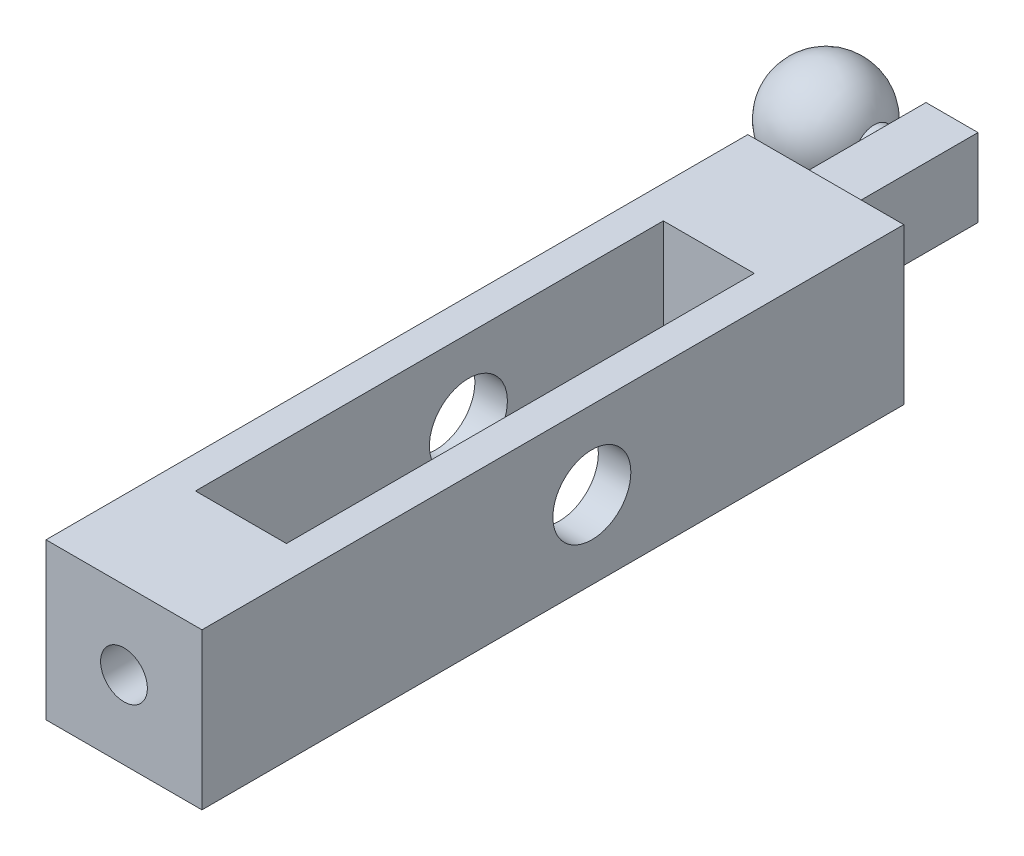
ISO-10303-21;
HEADER;
FILE_DESCRIPTION(('STEP AP214'),'2;1');
FILE_NAME('part.step','',(''),(''),'','','');
FILE_SCHEMA(('AUTOMOTIVE_DESIGN { 1 0 10303 214 1 1 1 1 }'));
ENDSEC;
DATA;
#1=APPLICATION_CONTEXT('core data for automotive mechanical design processes');
#2=APPLICATION_PROTOCOL_DEFINITION('international standard','automotive_design',2000,#1);
#3=PRODUCT_CONTEXT('',#1,'mechanical');
#4=PRODUCT('Part','Part','',(#3));
#5=PRODUCT_RELATED_PRODUCT_CATEGORY('part','',(#4));
#6=PRODUCT_DEFINITION_FORMATION('','',#4);
#7=PRODUCT_DEFINITION_CONTEXT('part definition',#1,'design');
#8=PRODUCT_DEFINITION('design','',#6,#7);
#9=PRODUCT_DEFINITION_SHAPE('','',#8);
#10=(LENGTH_UNIT() NAMED_UNIT(*) SI_UNIT(.MILLI.,.METRE.));
#11=(NAMED_UNIT(*) PLANE_ANGLE_UNIT() SI_UNIT($,.RADIAN.));
#12=(NAMED_UNIT(*) SI_UNIT($,.STERADIAN.) SOLID_ANGLE_UNIT());
#13=UNCERTAINTY_MEASURE_WITH_UNIT(LENGTH_MEASURE(1.E-05),#10,'distance_accuracy_value','');
#14=(GEOMETRIC_REPRESENTATION_CONTEXT(3) GLOBAL_UNCERTAINTY_ASSIGNED_CONTEXT((#13)) GLOBAL_UNIT_ASSIGNED_CONTEXT((#10,
#11,#12)) REPRESENTATION_CONTEXT('',''));
#15=CARTESIAN_POINT('',(0.,0.,0.));
#16=DIRECTION('',(0.,0.,1.));
#17=DIRECTION('',(1.,0.,0.));
#18=AXIS2_PLACEMENT_3D('',#15,#16,#17);
#19=CARTESIAN_POINT('',(3.,-3.,-27.));
#20=DIRECTION('',(0.,1.,0.));
#21=DIRECTION('',(-1.,0.,0.));
#22=AXIS2_PLACEMENT_3D('',#19,#20,#21);
#23=PLANE('',#22);
#24=DIRECTION('',(1.,0.,0.));
#25=VECTOR('',#24,1.);
#26=CARTESIAN_POINT('',(3.,-3.,0.));
#27=LINE('',#26,#25);
#28=CARTESIAN_POINT('',(-3.,-3.,0.));
#29=VERTEX_POINT('',#28);
#30=CARTESIAN_POINT('',(3.,-3.,0.));
#31=VERTEX_POINT('',#30);
#32=EDGE_CURVE('E224',#29,#31,#27,.T.);
#33=ORIENTED_EDGE('',*,*,#32,.F.);
#34=DIRECTION('',(0.,0.,1.));
#35=VECTOR('',#34,1.);
#36=CARTESIAN_POINT('',(-3.,-3.,-27.));
#37=LINE('',#36,#35);
#38=CARTESIAN_POINT('',(-3.,-3.,-27.));
#39=VERTEX_POINT('',#38);
#40=EDGE_CURVE('E52',#39,#29,#37,.T.);
#41=ORIENTED_EDGE('',*,*,#40,.F.);
#42=DIRECTION('',(1.,0.,0.));
#43=VECTOR('',#42,1.);
#44=CARTESIAN_POINT('',(3.,-3.,-27.));
#45=LINE('',#44,#43);
#46=CARTESIAN_POINT('',(3.,-3.,-27.));
#47=VERTEX_POINT('',#46);
#48=EDGE_CURVE('E213',#39,#47,#45,.T.);
#49=ORIENTED_EDGE('',*,*,#48,.T.);
#50=DIRECTION('',(0.,0.,1.));
#51=VECTOR('',#50,1.);
#52=CARTESIAN_POINT('',(3.,-3.,-27.));
#53=LINE('',#52,#51);
#54=EDGE_CURVE('E236',#47,#31,#53,.T.);
#55=ORIENTED_EDGE('',*,*,#54,.T.);
#56=EDGE_LOOP('',(#33,#41,#49,#55));
#57=FACE_BOUND('',#56,.T.);
#58=DIRECTION('',(1.,0.,0.));
#59=VECTOR('',#58,1.);
#60=CARTESIAN_POINT('',(3.,-3.,-4.5));
#61=LINE('',#60,#59);
#62=CARTESIAN_POINT('',(-1.75,-3.,-4.5));
#63=VERTEX_POINT('',#62);
#64=CARTESIAN_POINT('',(1.75,-3.,-4.5));
#65=VERTEX_POINT('',#64);
#66=EDGE_CURVE('E174',#63,#65,#61,.T.);
#67=ORIENTED_EDGE('',*,*,#66,.T.);
#68=DIRECTION('',(0.,0.,-1.));
#69=VECTOR('',#68,1.);
#70=CARTESIAN_POINT('',(1.74999999999999,-3.,-27.));
#71=LINE('',#70,#69);
#72=CARTESIAN_POINT('',(1.75,-3.,-22.5));
#73=VERTEX_POINT('',#72);
#74=EDGE_CURVE('E142',#65,#73,#71,.T.);
#75=ORIENTED_EDGE('',*,*,#74,.T.);
#76=DIRECTION('',(-1.,0.,0.));
#77=VECTOR('',#76,1.);
#78=CARTESIAN_POINT('',(3.,-3.,-22.5));
#79=LINE('',#78,#77);
#80=CARTESIAN_POINT('',(-1.75000000000001,-3.,-22.5));
#81=VERTEX_POINT('',#80);
#82=EDGE_CURVE('E170',#73,#81,#79,.T.);
#83=ORIENTED_EDGE('',*,*,#82,.T.);
#84=DIRECTION('',(0.,0.,1.));
#85=VECTOR('',#84,1.);
#86=CARTESIAN_POINT('',(-1.75000000000001,-3.,-27.));
#87=LINE('',#86,#85);
#88=EDGE_CURVE('E144',#81,#63,#87,.T.);
#89=ORIENTED_EDGE('',*,*,#88,.T.);
#90=EDGE_LOOP('',(#67,#75,#83,#89));
#91=FACE_BOUND('',#90,.T.);
#92=ADVANCED_FACE('F43',(#57,#91),#23,.F.);
#93=CARTESIAN_POINT('',(3.,3.,-27.));
#94=DIRECTION('',(0.,-1.,0.));
#95=DIRECTION('',(1.,0.,0.));
#96=AXIS2_PLACEMENT_3D('',#93,#94,#95);
#97=PLANE('',#96);
#98=DIRECTION('',(-1.,0.,0.));
#99=VECTOR('',#98,1.);
#100=CARTESIAN_POINT('',(3.,3.,0.));
#101=LINE('',#100,#99);
#102=CARTESIAN_POINT('',(3.,3.,0.));
#103=VERTEX_POINT('',#102);
#104=CARTESIAN_POINT('',(-3.,3.,0.));
#105=VERTEX_POINT('',#104);
#106=EDGE_CURVE('E214',#103,#105,#101,.T.);
#107=ORIENTED_EDGE('',*,*,#106,.F.);
#108=DIRECTION('',(0.,0.,1.));
#109=VECTOR('',#108,1.);
#110=CARTESIAN_POINT('',(3.,3.,-27.));
#111=LINE('',#110,#109);
#112=CARTESIAN_POINT('',(3.,3.,-27.));
#113=VERTEX_POINT('',#112);
#114=EDGE_CURVE('E233',#113,#103,#111,.T.);
#115=ORIENTED_EDGE('',*,*,#114,.F.);
#116=DIRECTION('',(-1.,0.,0.));
#117=VECTOR('',#116,1.);
#118=CARTESIAN_POINT('',(3.,3.,-27.));
#119=LINE('',#118,#117);
#120=CARTESIAN_POINT('',(-3.,3.,-27.));
#121=VERTEX_POINT('',#120);
#122=EDGE_CURVE('E219',#113,#121,#119,.T.);
#123=ORIENTED_EDGE('',*,*,#122,.T.);
#124=DIRECTION('',(0.,0.,1.));
#125=VECTOR('',#124,1.);
#126=CARTESIAN_POINT('',(-3.,3.,-27.));
#127=LINE('',#126,#125);
#128=EDGE_CURVE('E222',#121,#105,#127,.T.);
#129=ORIENTED_EDGE('',*,*,#128,.T.);
#130=EDGE_LOOP('',(#107,#115,#123,#129));
#131=FACE_BOUND('',#130,.T.);
#132=DIRECTION('',(1.,0.,0.));
#133=VECTOR('',#132,1.);
#134=CARTESIAN_POINT('',(-1.75,3.,-4.5));
#135=LINE('',#134,#133);
#136=CARTESIAN_POINT('',(-1.75,3.,-4.5));
#137=VERTEX_POINT('',#136);
#138=CARTESIAN_POINT('',(1.75,3.,-4.5));
#139=VERTEX_POINT('',#138);
#140=EDGE_CURVE('E151',#137,#139,#135,.T.);
#141=ORIENTED_EDGE('',*,*,#140,.F.);
#142=DIRECTION('',(0.,0.,1.));
#143=VECTOR('',#142,1.);
#144=CARTESIAN_POINT('',(-1.75,3.,-4.5));
#145=LINE('',#144,#143);
#146=CARTESIAN_POINT('',(-1.75,3.,-22.5));
#147=VERTEX_POINT('',#146);
#148=EDGE_CURVE('E163',#147,#137,#145,.T.);
#149=ORIENTED_EDGE('',*,*,#148,.F.);
#150=DIRECTION('',(-1.,0.,0.));
#151=VECTOR('',#150,1.);
#152=CARTESIAN_POINT('',(-1.75,3.,-22.5));
#153=LINE('',#152,#151);
#154=CARTESIAN_POINT('',(1.75,3.,-22.5));
#155=VERTEX_POINT('',#154);
#156=EDGE_CURVE('E152',#155,#147,#153,.T.);
#157=ORIENTED_EDGE('',*,*,#156,.F.);
#158=DIRECTION('',(0.,0.,-1.));
#159=VECTOR('',#158,1.);
#160=CARTESIAN_POINT('',(1.75,3.,-4.5));
#161=LINE('',#160,#159);
#162=EDGE_CURVE('E139',#139,#155,#161,.T.);
#163=ORIENTED_EDGE('',*,*,#162,.F.);
#164=EDGE_LOOP('',(#141,#149,#157,#163));
#165=FACE_BOUND('',#164,.T.);
#166=ADVANCED_FACE('F149',(#131,#165),#97,.F.);
#167=CARTESIAN_POINT('',(0.,0.,-27.));
#168=DIRECTION('',(0.,0.,-1.));
#169=DIRECTION('',(1.,0.,0.));
#170=AXIS2_PLACEMENT_3D('',#167,#168,#169);
#171=PLANE('',#170);
#172=DIRECTION('',(0.,-1.,0.));
#173=VECTOR('',#172,1.);
#174=CARTESIAN_POINT('',(-3.,-3.,-27.));
#175=LINE('',#174,#173);
#176=EDGE_CURVE('E211',#121,#39,#175,.T.);
#177=ORIENTED_EDGE('',*,*,#176,.F.);
#178=ORIENTED_EDGE('',*,*,#122,.F.);
#179=DIRECTION('',(0.,1.,0.));
#180=VECTOR('',#179,1.);
#181=CARTESIAN_POINT('',(3.,-3.,-27.));
#182=LINE('',#181,#180);
#183=EDGE_CURVE('E217',#47,#113,#182,.T.);
#184=ORIENTED_EDGE('',*,*,#183,.F.);
#185=ORIENTED_EDGE('',*,*,#48,.F.);
#186=EDGE_LOOP('',(#177,#178,#184,#185));
#187=FACE_BOUND('',#186,.T.);
#188=DIRECTION('',(-1.,0.,0.));
#189=VECTOR('',#188,1.);
#190=CARTESIAN_POINT('',(-2.14479354998716,1.49545918544692,-27.));
#191=LINE('',#190,#189);
#192=CARTESIAN_POINT('',(-0.144793549987163,1.49545918544692,-27.));
#193=VERTEX_POINT('',#192);
#194=CARTESIAN_POINT('',(-2.14479354998716,1.49545918544692,-27.));
#195=VERTEX_POINT('',#194);
#196=EDGE_CURVE('E195',#193,#195,#191,.T.);
#197=ORIENTED_EDGE('',*,*,#196,.T.);
#198=DIRECTION('',(0.,-1.,0.));
#199=VECTOR('',#198,1.);
#200=CARTESIAN_POINT('',(-2.14479354998716,1.49545918544692,-27.));
#201=LINE('',#200,#199);
#202=CARTESIAN_POINT('',(-2.14479354998716,-1.50454081455308,-27.));
#203=VERTEX_POINT('',#202);
#204=EDGE_CURVE('E198',#195,#203,#201,.T.);
#205=ORIENTED_EDGE('',*,*,#204,.T.);
#206=DIRECTION('',(1.,0.,0.));
#207=VECTOR('',#206,1.);
#208=CARTESIAN_POINT('',(-2.14479354998716,-1.50454081455308,-27.));
#209=LINE('',#208,#207);
#210=CARTESIAN_POINT('',(-0.144793549987163,-1.50454081455308,-27.));
#211=VERTEX_POINT('',#210);
#212=EDGE_CURVE('E184',#203,#211,#209,.T.);
#213=ORIENTED_EDGE('',*,*,#212,.T.);
#214=DIRECTION('',(0.,1.,0.));
#215=VECTOR('',#214,1.);
#216=CARTESIAN_POINT('',(-0.144793549987163,1.49545918544692,-27.));
#217=LINE('',#216,#215);
#218=EDGE_CURVE('E179',#211,#193,#217,.T.);
#219=ORIENTED_EDGE('',*,*,#218,.T.);
#220=EDGE_LOOP('',(#197,#205,#213,#219));
#221=FACE_BOUND('',#220,.T.);
#222=ADVANCED_FACE('F276',(#187,#221),#171,.T.);
#223=CARTESIAN_POINT('',(-3.,-3.,-27.));
#224=DIRECTION('',(1.,0.,0.));
#225=DIRECTION('',(0.,0.,1.));
#226=AXIS2_PLACEMENT_3D('',#223,#224,#225);
#227=PLANE('',#226);
#228=CARTESIAN_POINT('',(-3.,0.,-15.));
#229=DIRECTION('',(1.,0.,0.));
#230=DIRECTION('',(0.,0.,-1.));
#231=AXIS2_PLACEMENT_3D('',#228,#229,#230);
#232=CIRCLE('',#231,1.5);
#233=CARTESIAN_POINT('',(-3.,0.,-16.5));
#234=VERTEX_POINT('',#233);
#235=EDGE_CURVE('E242',#234,#234,#232,.T.);
#236=ORIENTED_EDGE('',*,*,#235,.T.);
#237=EDGE_LOOP('',(#236));
#238=FACE_BOUND('',#237,.T.);
#239=DIRECTION('',(0.,-1.,0.));
#240=VECTOR('',#239,1.);
#241=CARTESIAN_POINT('',(-3.,-3.,0.));
#242=LINE('',#241,#240);
#243=EDGE_CURVE('E210',#105,#29,#242,.T.);
#244=ORIENTED_EDGE('',*,*,#243,.F.);
#245=ORIENTED_EDGE('',*,*,#128,.F.);
#246=ORIENTED_EDGE('',*,*,#176,.T.);
#247=ORIENTED_EDGE('',*,*,#40,.T.);
#248=EDGE_LOOP('',(#244,#245,#246,#247));
#249=FACE_BOUND('',#248,.T.);
#250=ADVANCED_FACE('F45',(#238,#249),#227,.F.);
#251=CARTESIAN_POINT('',(3.,-3.,-27.));
#252=DIRECTION('',(-1.,0.,0.));
#253=DIRECTION('',(0.,0.,-1.));
#254=AXIS2_PLACEMENT_3D('',#251,#252,#253);
#255=PLANE('',#254);
#256=CARTESIAN_POINT('',(3.,0.,-15.));
#257=DIRECTION('',(1.,0.,0.));
#258=DIRECTION('',(0.,0.,-1.));
#259=AXIS2_PLACEMENT_3D('',#256,#257,#258);
#260=CIRCLE('',#259,1.5);
#261=CARTESIAN_POINT('',(3.,0.,-16.5));
#262=VERTEX_POINT('',#261);
#263=EDGE_CURVE('E155',#262,#262,#260,.T.);
#264=ORIENTED_EDGE('',*,*,#263,.F.);
#265=EDGE_LOOP('',(#264));
#266=FACE_BOUND('',#265,.T.);
#267=DIRECTION('',(0.,1.,0.));
#268=VECTOR('',#267,1.);
#269=CARTESIAN_POINT('',(3.,-3.,0.));
#270=LINE('',#269,#268);
#271=EDGE_CURVE('E227',#31,#103,#270,.T.);
#272=ORIENTED_EDGE('',*,*,#271,.F.);
#273=ORIENTED_EDGE('',*,*,#54,.F.);
#274=ORIENTED_EDGE('',*,*,#183,.T.);
#275=ORIENTED_EDGE('',*,*,#114,.T.);
#276=EDGE_LOOP('',(#272,#273,#274,#275));
#277=FACE_BOUND('',#276,.T.);
#278=ADVANCED_FACE('F282',(#266,#277),#255,.F.);
#279=CARTESIAN_POINT('',(0.,0.,0.));
#280=DIRECTION('',(0.,0.,-1.));
#281=DIRECTION('',(1.,0.,0.));
#282=AXIS2_PLACEMENT_3D('',#279,#280,#281);
#283=PLANE('',#282);
#284=CARTESIAN_POINT('',(0.,0.,0.));
#285=DIRECTION('',(0.,0.,-1.));
#286=DIRECTION('',(-1.,0.,0.));
#287=AXIS2_PLACEMENT_3D('',#284,#285,#286);
#288=CIRCLE('',#287,0.9);
#289=CARTESIAN_POINT('',(-0.9,0.,0.));
#290=VERTEX_POINT('',#289);
#291=EDGE_CURVE('E251',#290,#290,#288,.T.);
#292=ORIENTED_EDGE('',*,*,#291,.T.);
#293=EDGE_LOOP('',(#292));
#294=FACE_BOUND('',#293,.T.);
#295=ORIENTED_EDGE('',*,*,#243,.T.);
#296=ORIENTED_EDGE('',*,*,#32,.T.);
#297=ORIENTED_EDGE('',*,*,#271,.T.);
#298=ORIENTED_EDGE('',*,*,#106,.T.);
#299=EDGE_LOOP('',(#295,#296,#297,#298));
#300=FACE_BOUND('',#299,.T.);
#301=ADVANCED_FACE('F256',(#294,#300),#283,.F.);
#302=CARTESIAN_POINT('',(-0.144793549987163,1.49545918544692,-33.));
#303=DIRECTION('',(-1.,0.,0.));
#304=DIRECTION('',(0.,-1.,0.));
#305=AXIS2_PLACEMENT_3D('',#302,#303,#304);
#306=PLANE('',#305);
#307=ORIENTED_EDGE('',*,*,#218,.F.);
#308=DIRECTION('',(0.,0.,1.));
#309=VECTOR('',#308,1.);
#310=CARTESIAN_POINT('',(-0.144793549987163,-1.50454081455308,-33.));
#311=LINE('',#310,#309);
#312=CARTESIAN_POINT('',(-0.144793549987163,-1.50454081455308,-33.));
#313=VERTEX_POINT('',#312);
#314=EDGE_CURVE('E192',#313,#211,#311,.T.);
#315=ORIENTED_EDGE('',*,*,#314,.F.);
#316=DIRECTION('',(0.,1.,0.));
#317=VECTOR('',#316,1.);
#318=CARTESIAN_POINT('',(-0.144793549987163,1.49545918544692,-33.));
#319=LINE('',#318,#317);
#320=CARTESIAN_POINT('',(-0.144793549987163,1.49545918544692,-33.));
#321=VERTEX_POINT('',#320);
#322=EDGE_CURVE('E180',#313,#321,#319,.T.);
#323=ORIENTED_EDGE('',*,*,#322,.T.);
#324=DIRECTION('',(0.,0.,1.));
#325=VECTOR('',#324,1.);
#326=CARTESIAN_POINT('',(-0.144793549987163,1.49545918544692,-33.));
#327=LINE('',#326,#325);
#328=EDGE_CURVE('E208',#321,#193,#327,.T.);
#329=ORIENTED_EDGE('',*,*,#328,.T.);
#330=EDGE_LOOP('',(#307,#315,#323,#329));
#331=FACE_BOUND('',#330,.T.);
#332=ADVANCED_FACE('F288',(#331),#306,.F.);
#333=CARTESIAN_POINT('',(-2.14479354998716,1.49545918544692,-33.));
#334=DIRECTION('',(0.,-1.,0.));
#335=DIRECTION('',(1.,0.,0.));
#336=AXIS2_PLACEMENT_3D('',#333,#334,#335);
#337=PLANE('',#336);
#338=ORIENTED_EDGE('',*,*,#196,.F.);
#339=ORIENTED_EDGE('',*,*,#328,.F.);
#340=DIRECTION('',(-1.,0.,0.));
#341=VECTOR('',#340,1.);
#342=CARTESIAN_POINT('',(-2.14479354998716,1.49545918544692,-33.));
#343=LINE('',#342,#341);
#344=CARTESIAN_POINT('',(-2.14479354998716,1.49545918544692,-33.));
#345=VERTEX_POINT('',#344);
#346=EDGE_CURVE('E183',#321,#345,#343,.T.);
#347=ORIENTED_EDGE('',*,*,#346,.T.);
#348=DIRECTION('',(0.,0.,1.));
#349=VECTOR('',#348,1.);
#350=CARTESIAN_POINT('',(-2.14479354998716,1.49545918544692,-33.));
#351=LINE('',#350,#349);
#352=EDGE_CURVE('E206',#345,#195,#351,.T.);
#353=ORIENTED_EDGE('',*,*,#352,.T.);
#354=EDGE_LOOP('',(#338,#339,#347,#353));
#355=FACE_BOUND('',#354,.T.);
#356=ADVANCED_FACE('F294',(#355),#337,.F.);
#357=CARTESIAN_POINT('',(-2.14479354998716,1.49545918544692,-33.));
#358=DIRECTION('',(1.,0.,0.));
#359=DIRECTION('',(0.,1.,0.));
#360=AXIS2_PLACEMENT_3D('',#357,#358,#359);
#361=PLANE('',#360);
#362=CARTESIAN_POINT('',(-2.14479354998716,0.,-32.));
#363=DIRECTION('',(-1.,0.,0.));
#364=DIRECTION('',(0.,1.,0.));
#365=AXIS2_PLACEMENT_3D('',#362,#363,#364);
#366=CIRCLE('',#365,0.749999999999999);
#367=CARTESIAN_POINT('',(-2.14479354998716,0.749999999999998,-32.));
#368=VERTEX_POINT('',#367);
#369=EDGE_CURVE('E11',#368,#368,#366,.F.);
#370=ORIENTED_EDGE('',*,*,#369,.T.);
#371=EDGE_LOOP('',(#370));
#372=FACE_BOUND('',#371,.T.);
#373=ORIENTED_EDGE('',*,*,#204,.F.);
#374=ORIENTED_EDGE('',*,*,#352,.F.);
#375=DIRECTION('',(0.,-1.,0.));
#376=VECTOR('',#375,1.);
#377=CARTESIAN_POINT('',(-2.14479354998716,1.49545918544692,-33.));
#378=LINE('',#377,#376);
#379=CARTESIAN_POINT('',(-2.14479354998716,-1.50454081455308,-33.));
#380=VERTEX_POINT('',#379);
#381=EDGE_CURVE('E187',#345,#380,#378,.T.);
#382=ORIENTED_EDGE('',*,*,#381,.T.);
#383=DIRECTION('',(0.,0.,1.));
#384=VECTOR('',#383,1.);
#385=CARTESIAN_POINT('',(-2.14479354998716,-1.50454081455308,-33.));
#386=LINE('',#385,#384);
#387=EDGE_CURVE('E204',#380,#203,#386,.T.);
#388=ORIENTED_EDGE('',*,*,#387,.T.);
#389=EDGE_LOOP('',(#373,#374,#382,#388));
#390=FACE_BOUND('',#389,.T.);
#391=ADVANCED_FACE('F298',(#372,#390),#361,.F.);
#392=CARTESIAN_POINT('',(-2.14479354998716,-1.50454081455308,-33.));
#393=DIRECTION('',(0.,1.,0.));
#394=DIRECTION('',(-1.,0.,0.));
#395=AXIS2_PLACEMENT_3D('',#392,#393,#394);
#396=PLANE('',#395);
#397=ORIENTED_EDGE('',*,*,#212,.F.);
#398=ORIENTED_EDGE('',*,*,#387,.F.);
#399=DIRECTION('',(1.,0.,0.));
#400=VECTOR('',#399,1.);
#401=CARTESIAN_POINT('',(-2.14479354998716,-1.50454081455308,-33.));
#402=LINE('',#401,#400);
#403=EDGE_CURVE('E190',#380,#313,#402,.T.);
#404=ORIENTED_EDGE('',*,*,#403,.T.);
#405=ORIENTED_EDGE('',*,*,#314,.T.);
#406=EDGE_LOOP('',(#397,#398,#404,#405));
#407=FACE_BOUND('',#406,.T.);
#408=ADVANCED_FACE('F302',(#407),#396,.F.);
#409=CARTESIAN_POINT('',(0.,0.,-33.));
#410=DIRECTION('',(0.,0.,-1.));
#411=DIRECTION('',(1.,0.,0.));
#412=AXIS2_PLACEMENT_3D('',#409,#410,#411);
#413=PLANE('',#412);
#414=ORIENTED_EDGE('',*,*,#322,.F.);
#415=ORIENTED_EDGE('',*,*,#403,.F.);
#416=ORIENTED_EDGE('',*,*,#381,.F.);
#417=ORIENTED_EDGE('',*,*,#346,.F.);
#418=EDGE_LOOP('',(#414,#415,#416,#417));
#419=FACE_BOUND('',#418,.T.);
#420=ADVANCED_FACE('F306',(#419),#413,.T.);
#421=CARTESIAN_POINT('',(-3.14479354998716,0.,-32.));
#422=DIRECTION('',(1.,0.,0.));
#423=DIRECTION('',(0.,1.,0.));
#424=AXIS2_PLACEMENT_3D('',#421,#422,#423);
#425=CYLINDRICAL_SURFACE('',#424,0.749999999999999);
#426=CARTESIAN_POINT('',(-3.14479354998716,0.,-32.));
#427=DIRECTION('',(1.,0.,0.));
#428=DIRECTION('',(0.,-1.,0.));
#429=AXIS2_PLACEMENT_3D('',#426,#427,#428);
#430=CIRCLE('',#429,0.749999999999999);
#431=CARTESIAN_POINT('',(-3.14479354998716,-0.749999999999999,-32.));
#432=VERTEX_POINT('',#431);
#433=EDGE_CURVE('E176',#432,#432,#430,.T.);
#434=ORIENTED_EDGE('',*,*,#433,.T.);
#435=EDGE_LOOP('',(#434));
#436=FACE_BOUND('',#435,.T.);
#437=ORIENTED_EDGE('',*,*,#369,.F.);
#438=EDGE_LOOP('',(#437));
#439=FACE_BOUND('',#438,.T.);
#440=ADVANCED_FACE('F310',(#436,#439),#425,.T.);
#441=CARTESIAN_POINT('',(-4.99884317176108,0.,-32.));
#442=DIRECTION('',(1.,0.,0.));
#443=DIRECTION('',(0.,0.,1.));
#444=AXIS2_PLACEMENT_3D('',#441,#442,#443);
#445=SPHERICAL_SURFACE('',#444,2.);
#446=ORIENTED_EDGE('',*,*,#433,.F.);
#447=EDGE_LOOP('',(#446));
#448=FACE_BOUND('',#447,.T.);
#449=ADVANCED_FACE('F314',(#448),#445,.T.);
#450=CARTESIAN_POINT('',(-1.75,-5.,-4.5));
#451=DIRECTION('',(0.,0.,-1.));
#452=DIRECTION('',(1.,0.,0.));
#453=AXIS2_PLACEMENT_3D('',#450,#451,#452);
#454=PLANE('',#453);
#455=CARTESIAN_POINT('',(0.,0.,-4.5));
#456=DIRECTION('',(0.,0.,1.));
#457=DIRECTION('',(1.,0.,0.));
#458=AXIS2_PLACEMENT_3D('',#455,#456,#457);
#459=CIRCLE('',#458,0.9);
#460=CARTESIAN_POINT('',(0.9,0.,-4.5));
#461=VERTEX_POINT('',#460);
#462=EDGE_CURVE('E47',#461,#461,#459,.T.);
#463=ORIENTED_EDGE('',*,*,#462,.T.);
#464=EDGE_LOOP('',(#463));
#465=FACE_BOUND('',#464,.T.);
#466=ORIENTED_EDGE('',*,*,#66,.F.);
#467=DIRECTION('',(0.,1.,0.));
#468=VECTOR('',#467,1.);
#469=CARTESIAN_POINT('',(-1.75,-5.,-4.5));
#470=LINE('',#469,#468);
#471=EDGE_CURVE('E68',#63,#137,#470,.T.);
#472=ORIENTED_EDGE('',*,*,#471,.T.);
#473=ORIENTED_EDGE('',*,*,#140,.T.);
#474=DIRECTION('',(0.,1.,0.));
#475=VECTOR('',#474,1.);
#476=CARTESIAN_POINT('',(1.75,-5.,-4.5));
#477=LINE('',#476,#475);
#478=EDGE_CURVE('E136',#65,#139,#477,.T.);
#479=ORIENTED_EDGE('',*,*,#478,.F.);
#480=EDGE_LOOP('',(#466,#472,#473,#479));
#481=FACE_BOUND('',#480,.T.);
#482=ADVANCED_FACE('F154',(#465,#481),#454,.T.);
#483=CARTESIAN_POINT('',(1.75,-5.,-4.5));
#484=DIRECTION('',(-1.,0.,0.));
#485=DIRECTION('',(0.,-1.,0.));
#486=AXIS2_PLACEMENT_3D('',#483,#484,#485);
#487=PLANE('',#486);
#488=CARTESIAN_POINT('',(1.75,0.,-15.));
#489=DIRECTION('',(1.,0.,0.));
#490=DIRECTION('',(0.,-1.,0.));
#491=AXIS2_PLACEMENT_3D('',#488,#489,#490);
#492=CIRCLE('',#491,1.5);
#493=CARTESIAN_POINT('',(1.75,-1.5,-15.));
#494=VERTEX_POINT('',#493);
#495=EDGE_CURVE('E158',#494,#494,#492,.T.);
#496=ORIENTED_EDGE('',*,*,#495,.T.);
#497=EDGE_LOOP('',(#496));
#498=FACE_BOUND('',#497,.T.);
#499=ORIENTED_EDGE('',*,*,#74,.F.);
#500=ORIENTED_EDGE('',*,*,#478,.T.);
#501=ORIENTED_EDGE('',*,*,#162,.T.);
#502=DIRECTION('',(0.,1.,0.));
#503=VECTOR('',#502,1.);
#504=CARTESIAN_POINT('',(1.74999999999999,-5.,-22.5));
#505=LINE('',#504,#503);
#506=EDGE_CURVE('E145',#73,#155,#505,.T.);
#507=ORIENTED_EDGE('',*,*,#506,.F.);
#508=EDGE_LOOP('',(#499,#500,#501,#507));
#509=FACE_BOUND('',#508,.T.);
#510=ADVANCED_FACE('F138',(#498,#509),#487,.T.);
#511=CARTESIAN_POINT('',(-1.75000000000001,-5.,-22.5));
#512=DIRECTION('',(0.,0.,1.));
#513=DIRECTION('',(-1.,0.,0.));
#514=AXIS2_PLACEMENT_3D('',#511,#512,#513);
#515=PLANE('',#514);
#516=ORIENTED_EDGE('',*,*,#82,.F.);
#517=ORIENTED_EDGE('',*,*,#506,.T.);
#518=ORIENTED_EDGE('',*,*,#156,.T.);
#519=DIRECTION('',(0.,1.,0.));
#520=VECTOR('',#519,1.);
#521=CARTESIAN_POINT('',(-1.75000000000001,-5.,-22.5));
#522=LINE('',#521,#520);
#523=EDGE_CURVE('E60',#81,#147,#522,.T.);
#524=ORIENTED_EDGE('',*,*,#523,.F.);
#525=EDGE_LOOP('',(#516,#517,#518,#524));
#526=FACE_BOUND('',#525,.T.);
#527=ADVANCED_FACE('F324',(#526),#515,.T.);
#528=CARTESIAN_POINT('',(-1.75,-5.,-4.5));
#529=DIRECTION('',(1.,0.,0.));
#530=DIRECTION('',(0.,1.,0.));
#531=AXIS2_PLACEMENT_3D('',#528,#529,#530);
#532=PLANE('',#531);
#533=CARTESIAN_POINT('',(-1.75,0.,-15.));
#534=DIRECTION('',(-1.,0.,0.));
#535=DIRECTION('',(0.,1.,0.));
#536=AXIS2_PLACEMENT_3D('',#533,#534,#535);
#537=CIRCLE('',#536,1.5);
#538=CARTESIAN_POINT('',(-1.75,1.5,-15.));
#539=VERTEX_POINT('',#538);
#540=EDGE_CURVE('E240',#539,#539,#537,.T.);
#541=ORIENTED_EDGE('',*,*,#540,.T.);
#542=EDGE_LOOP('',(#541));
#543=FACE_BOUND('',#542,.T.);
#544=ORIENTED_EDGE('',*,*,#88,.F.);
#545=ORIENTED_EDGE('',*,*,#523,.T.);
#546=ORIENTED_EDGE('',*,*,#148,.T.);
#547=ORIENTED_EDGE('',*,*,#471,.F.);
#548=EDGE_LOOP('',(#544,#545,#546,#547));
#549=FACE_BOUND('',#548,.T.);
#550=ADVANCED_FACE('F328',(#543,#549),#532,.T.);
#551=CARTESIAN_POINT('',(5.,0.,-15.));
#552=DIRECTION('',(-1.,0.,0.));
#553=DIRECTION('',(0.,0.,-1.));
#554=AXIS2_PLACEMENT_3D('',#551,#552,#553);
#555=CYLINDRICAL_SURFACE('',#554,1.5);
#556=ORIENTED_EDGE('',*,*,#540,.F.);
#557=EDGE_LOOP('',(#556));
#558=FACE_BOUND('',#557,.T.);
#559=ORIENTED_EDGE('',*,*,#235,.F.);
#560=EDGE_LOOP('',(#559));
#561=FACE_BOUND('',#560,.T.);
#562=ADVANCED_FACE('F267',(#558,#561),#555,.F.);
#563=ORIENTED_EDGE('',*,*,#495,.F.);
#564=EDGE_LOOP('',(#563));
#565=FACE_BOUND('',#564,.T.);
#566=ORIENTED_EDGE('',*,*,#263,.T.);
#567=EDGE_LOOP('',(#566));
#568=FACE_BOUND('',#567,.T.);
#569=ADVANCED_FACE('F261',(#565,#568),#555,.F.);
#570=CARTESIAN_POINT('',(0.,0.,-8.));
#571=DIRECTION('',(0.,0.,1.));
#572=DIRECTION('',(-1.,0.,0.));
#573=AXIS2_PLACEMENT_3D('',#570,#571,#572);
#574=CYLINDRICAL_SURFACE('',#573,0.9);
#575=ORIENTED_EDGE('',*,*,#462,.F.);
#576=EDGE_LOOP('',(#575));
#577=FACE_BOUND('',#576,.T.);
#578=ORIENTED_EDGE('',*,*,#291,.F.);
#579=EDGE_LOOP('',(#578));
#580=FACE_BOUND('',#579,.T.);
#581=ADVANCED_FACE('F259',(#577,#580),#574,.F.);
#582=CLOSED_SHELL('',(#92,#166,#222,#250,#278,#301,#332,#356,#391,#408,#420,#440,#449,#482,#510,
#527,#550,#562,#569,#581));
#583=MANIFOLD_SOLID_BREP('B2',#582);
#584=ADVANCED_BREP_SHAPE_REPRESENTATION('',(#18,#583),#14);
#585=SHAPE_DEFINITION_REPRESENTATION(#9,#584);
ENDSEC;
END-ISO-10303-21;
